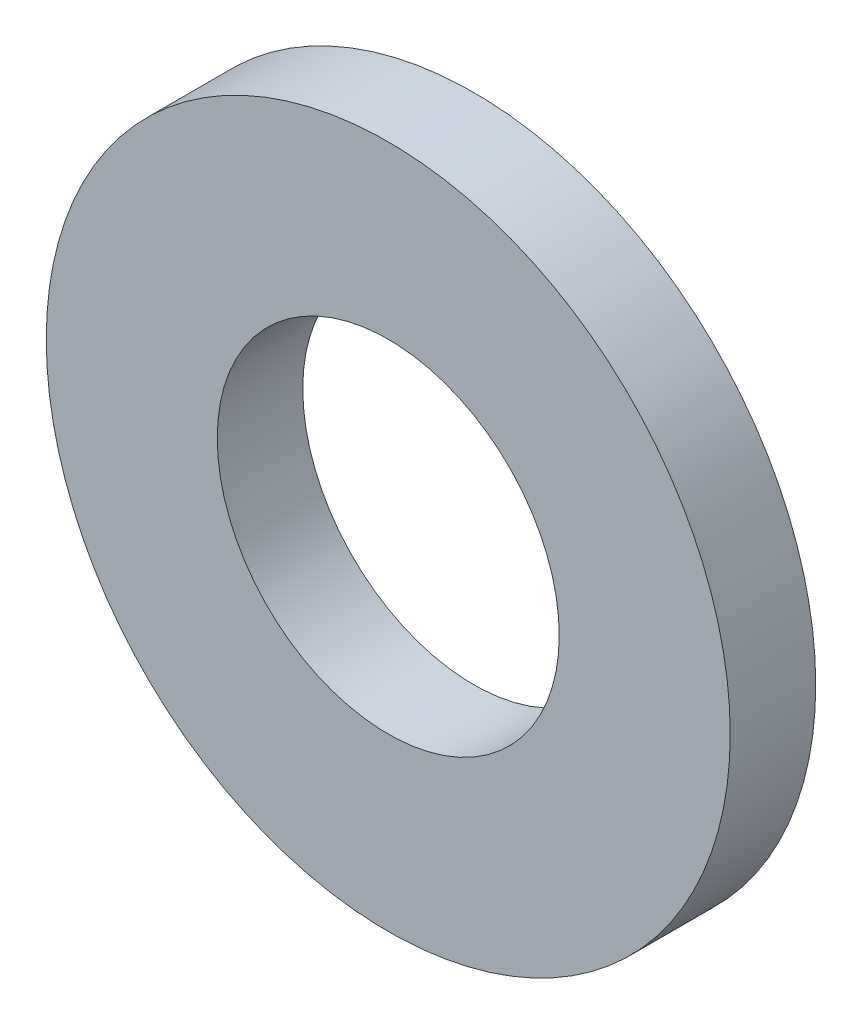
ISO-10303-21;
HEADER;
FILE_DESCRIPTION(('STEP AP214'),'2;1');
FILE_NAME('part.step','',(''),(''),'','','');
FILE_SCHEMA(('AUTOMOTIVE_DESIGN { 1 0 10303 214 1 1 1 1 }'));
ENDSEC;
DATA;
#1=APPLICATION_CONTEXT('core data for automotive mechanical design processes');
#2=APPLICATION_PROTOCOL_DEFINITION('international standard','automotive_design',2000,#1);
#3=PRODUCT_CONTEXT('',#1,'mechanical');
#4=PRODUCT('Part','Part','',(#3));
#5=PRODUCT_RELATED_PRODUCT_CATEGORY('part','',(#4));
#6=PRODUCT_DEFINITION_FORMATION('','',#4);
#7=PRODUCT_DEFINITION_CONTEXT('part definition',#1,'design');
#8=PRODUCT_DEFINITION('design','',#6,#7);
#9=PRODUCT_DEFINITION_SHAPE('','',#8);
#10=(LENGTH_UNIT() NAMED_UNIT(*) SI_UNIT(.MILLI.,.METRE.));
#11=(NAMED_UNIT(*) PLANE_ANGLE_UNIT() SI_UNIT($,.RADIAN.));
#12=(NAMED_UNIT(*) SI_UNIT($,.STERADIAN.) SOLID_ANGLE_UNIT());
#13=UNCERTAINTY_MEASURE_WITH_UNIT(LENGTH_MEASURE(1.E-05),#10,'distance_accuracy_value','');
#14=(GEOMETRIC_REPRESENTATION_CONTEXT(3) GLOBAL_UNCERTAINTY_ASSIGNED_CONTEXT((#13)) GLOBAL_UNIT_ASSIGNED_CONTEXT((#10,
#11,#12)) REPRESENTATION_CONTEXT('',''));
#15=CARTESIAN_POINT('',(0.,0.,0.));
#16=DIRECTION('',(0.,0.,1.));
#17=DIRECTION('',(1.,0.,0.));
#18=AXIS2_PLACEMENT_3D('',#15,#16,#17);
#19=CARTESIAN_POINT('',(0.,0.,1.5));
#20=DIRECTION('',(0.,0.,1.));
#21=DIRECTION('',(1.,0.,0.));
#22=AXIS2_PLACEMENT_3D('',#19,#20,#21);
#23=PLANE('',#22);
#24=CARTESIAN_POINT('',(0.,0.,1.5));
#25=DIRECTION('',(0.,0.,1.));
#26=DIRECTION('',(1.,0.,0.));
#27=AXIS2_PLACEMENT_3D('',#24,#25,#26);
#28=CIRCLE('',#27,6.);
#29=CARTESIAN_POINT('',(6.,0.,1.5));
#30=VERTEX_POINT('',#29);
#31=EDGE_CURVE('E10',#30,#30,#28,.T.);
#32=ORIENTED_EDGE('',*,*,#31,.T.);
#33=EDGE_LOOP('',(#32));
#34=FACE_BOUND('',#33,.T.);
#35=CARTESIAN_POINT('',(0.,0.,1.5));
#36=DIRECTION('',(0.,0.,1.));
#37=DIRECTION('',(1.,0.,0.));
#38=AXIS2_PLACEMENT_3D('',#35,#36,#37);
#39=CIRCLE('',#38,3.);
#40=CARTESIAN_POINT('',(3.,0.,1.5));
#41=VERTEX_POINT('',#40);
#42=EDGE_CURVE('E46',#41,#41,#39,.T.);
#43=ORIENTED_EDGE('',*,*,#42,.F.);
#44=EDGE_LOOP('',(#43));
#45=FACE_BOUND('',#44,.T.);
#46=ADVANCED_FACE('F35',(#34,#45),#23,.T.);
#47=CARTESIAN_POINT('',(0.,0.,0.));
#48=DIRECTION('',(0.,0.,1.));
#49=DIRECTION('',(1.,0.,0.));
#50=AXIS2_PLACEMENT_3D('',#47,#48,#49);
#51=PLANE('',#50);
#52=CARTESIAN_POINT('',(0.,0.,0.));
#53=DIRECTION('',(0.,0.,1.));
#54=DIRECTION('',(1.,0.,0.));
#55=AXIS2_PLACEMENT_3D('',#52,#53,#54);
#56=CIRCLE('',#55,6.);
#57=CARTESIAN_POINT('',(6.,0.,0.));
#58=VERTEX_POINT('',#57);
#59=EDGE_CURVE('E39',#58,#58,#56,.T.);
#60=ORIENTED_EDGE('',*,*,#59,.F.);
#61=EDGE_LOOP('',(#60));
#62=FACE_BOUND('',#61,.T.);
#63=CARTESIAN_POINT('',(0.,0.,0.));
#64=DIRECTION('',(0.,0.,1.));
#65=DIRECTION('',(1.,0.,0.));
#66=AXIS2_PLACEMENT_3D('',#63,#64,#65);
#67=CIRCLE('',#66,3.);
#68=CARTESIAN_POINT('',(3.,0.,0.));
#69=VERTEX_POINT('',#68);
#70=EDGE_CURVE('E48',#69,#69,#67,.T.);
#71=ORIENTED_EDGE('',*,*,#70,.T.);
#72=EDGE_LOOP('',(#71));
#73=FACE_BOUND('',#72,.T.);
#74=ADVANCED_FACE('F58',(#62,#73),#51,.F.);
#75=CARTESIAN_POINT('',(0.,0.,1.5));
#76=DIRECTION('',(0.,0.,-1.));
#77=DIRECTION('',(-1.,0.,0.));
#78=AXIS2_PLACEMENT_3D('',#75,#76,#77);
#79=CYLINDRICAL_SURFACE('',#78,6.);
#80=ORIENTED_EDGE('',*,*,#31,.F.);
#81=EDGE_LOOP('',(#80));
#82=FACE_BOUND('',#81,.T.);
#83=ORIENTED_EDGE('',*,*,#59,.T.);
#84=EDGE_LOOP('',(#83));
#85=FACE_BOUND('',#84,.T.);
#86=ADVANCED_FACE('F37',(#82,#85),#79,.T.);
#87=CARTESIAN_POINT('',(0.,0.,1.5));
#88=DIRECTION('',(0.,0.,-1.));
#89=DIRECTION('',(-1.,0.,0.));
#90=AXIS2_PLACEMENT_3D('',#87,#88,#89);
#91=CYLINDRICAL_SURFACE('',#90,3.);
#92=ORIENTED_EDGE('',*,*,#42,.T.);
#93=EDGE_LOOP('',(#92));
#94=FACE_BOUND('',#93,.T.);
#95=ORIENTED_EDGE('',*,*,#70,.F.);
#96=EDGE_LOOP('',(#95));
#97=FACE_BOUND('',#96,.T.);
#98=ADVANCED_FACE('F54',(#94,#97),#91,.F.);
#99=CLOSED_SHELL('',(#46,#74,#86,#98));
#100=MANIFOLD_SOLID_BREP('B2',#99);
#101=ADVANCED_BREP_SHAPE_REPRESENTATION('',(#18,#100),#14);
#102=SHAPE_DEFINITION_REPRESENTATION(#9,#101);
ENDSEC;
END-ISO-10303-21;
